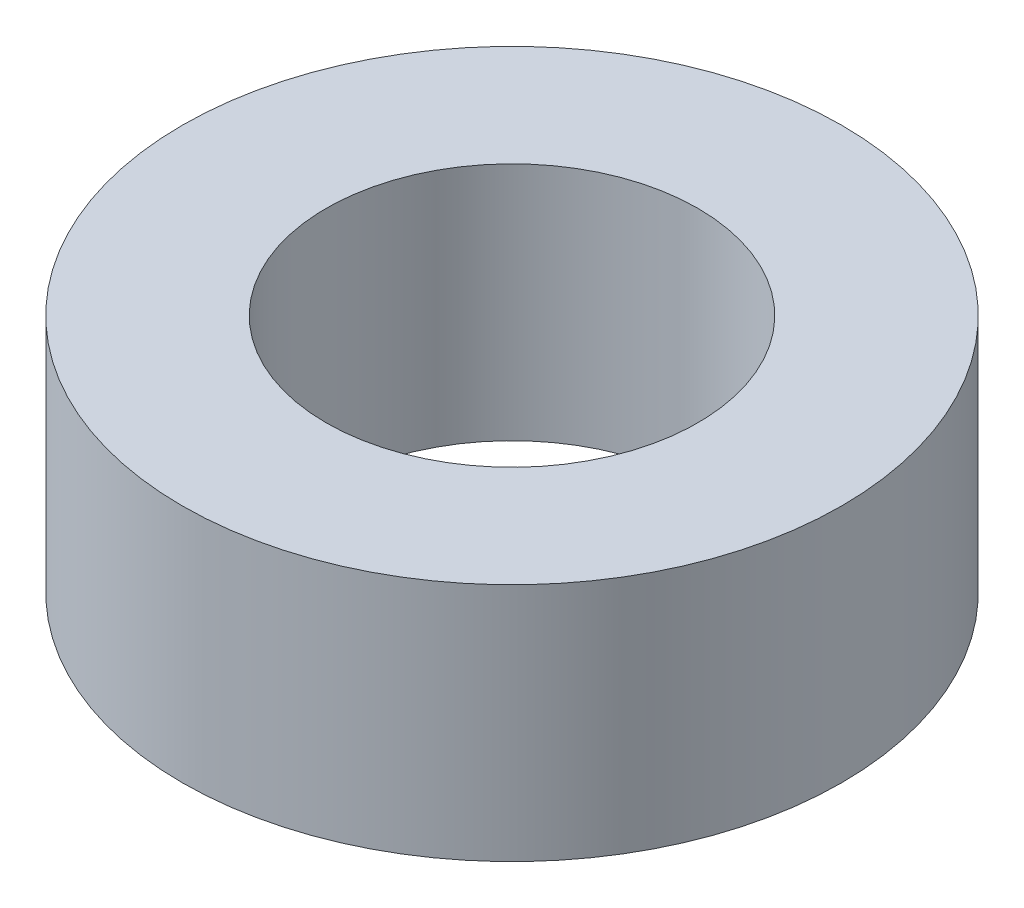
ISO-10303-21;
HEADER;
FILE_DESCRIPTION(('STEP AP214'),'2;1');
FILE_NAME('part.step','',(''),(''),'','','');
FILE_SCHEMA(('AUTOMOTIVE_DESIGN { 1 0 10303 214 1 1 1 1 }'));
ENDSEC;
DATA;
#1=APPLICATION_CONTEXT('core data for automotive mechanical design processes');
#2=APPLICATION_PROTOCOL_DEFINITION('international standard','automotive_design',2000,#1);
#3=PRODUCT_CONTEXT('',#1,'mechanical');
#4=PRODUCT('Part','Part','',(#3));
#5=PRODUCT_RELATED_PRODUCT_CATEGORY('part','',(#4));
#6=PRODUCT_DEFINITION_FORMATION('','',#4);
#7=PRODUCT_DEFINITION_CONTEXT('part definition',#1,'design');
#8=PRODUCT_DEFINITION('design','',#6,#7);
#9=PRODUCT_DEFINITION_SHAPE('','',#8);
#10=(LENGTH_UNIT() NAMED_UNIT(*) SI_UNIT(.MILLI.,.METRE.));
#11=(NAMED_UNIT(*) PLANE_ANGLE_UNIT() SI_UNIT($,.RADIAN.));
#12=(NAMED_UNIT(*) SI_UNIT($,.STERADIAN.) SOLID_ANGLE_UNIT());
#13=UNCERTAINTY_MEASURE_WITH_UNIT(LENGTH_MEASURE(1.E-05),#10,'distance_accuracy_value','');
#14=(GEOMETRIC_REPRESENTATION_CONTEXT(3) GLOBAL_UNCERTAINTY_ASSIGNED_CONTEXT((#13)) GLOBAL_UNIT_ASSIGNED_CONTEXT((#10,
#11,#12)) REPRESENTATION_CONTEXT('',''));
#15=CARTESIAN_POINT('',(0.,0.,0.));
#16=DIRECTION('',(0.,0.,1.));
#17=DIRECTION('',(1.,0.,0.));
#18=AXIS2_PLACEMENT_3D('',#15,#16,#17);
#19=CARTESIAN_POINT('',(0.,2.,0.));
#20=DIRECTION('',(0.,1.,0.));
#21=DIRECTION('',(0.,0.,1.));
#22=AXIS2_PLACEMENT_3D('',#19,#20,#21);
#23=PLANE('',#22);
#24=CARTESIAN_POINT('',(0.,2.,0.));
#25=DIRECTION('',(0.,1.,0.));
#26=DIRECTION('',(0.,0.,1.));
#27=AXIS2_PLACEMENT_3D('',#24,#25,#26);
#28=CIRCLE('',#27,2.75);
#29=CARTESIAN_POINT('',(0.,2.,2.75));
#30=VERTEX_POINT('',#29);
#31=EDGE_CURVE('E10',#30,#30,#28,.T.);
#32=ORIENTED_EDGE('',*,*,#31,.T.);
#33=EDGE_LOOP('',(#32));
#34=FACE_BOUND('',#33,.T.);
#35=CARTESIAN_POINT('',(0.,2.,0.));
#36=DIRECTION('',(0.,1.,0.));
#37=DIRECTION('',(0.,0.,1.));
#38=AXIS2_PLACEMENT_3D('',#35,#36,#37);
#39=CIRCLE('',#38,1.55);
#40=CARTESIAN_POINT('',(0.,2.,1.55));
#41=VERTEX_POINT('',#40);
#42=EDGE_CURVE('E55',#41,#41,#39,.T.);
#43=ORIENTED_EDGE('',*,*,#42,.F.);
#44=EDGE_LOOP('',(#43));
#45=FACE_BOUND('',#44,.T.);
#46=ADVANCED_FACE('F41',(#34,#45),#23,.T.);
#47=CARTESIAN_POINT('',(0.,0.,0.));
#48=DIRECTION('',(0.,1.,0.));
#49=DIRECTION('',(0.,0.,1.));
#50=AXIS2_PLACEMENT_3D('',#47,#48,#49);
#51=PLANE('',#50);
#52=CARTESIAN_POINT('',(0.,0.,0.));
#53=DIRECTION('',(0.,1.,0.));
#54=DIRECTION('',(0.,0.,1.));
#55=AXIS2_PLACEMENT_3D('',#52,#53,#54);
#56=CIRCLE('',#55,2.75);
#57=CARTESIAN_POINT('',(0.,0.,2.75));
#58=VERTEX_POINT('',#57);
#59=EDGE_CURVE('E45',#58,#58,#56,.T.);
#60=ORIENTED_EDGE('',*,*,#59,.F.);
#61=EDGE_LOOP('',(#60));
#62=FACE_BOUND('',#61,.T.);
#63=CARTESIAN_POINT('',(0.,0.,0.));
#64=DIRECTION('',(0.,1.,0.));
#65=DIRECTION('',(0.,0.,1.));
#66=AXIS2_PLACEMENT_3D('',#63,#64,#65);
#67=CIRCLE('',#66,1.55);
#68=CARTESIAN_POINT('',(0.,0.,1.55));
#69=VERTEX_POINT('',#68);
#70=EDGE_CURVE('E57',#69,#69,#67,.T.);
#71=ORIENTED_EDGE('',*,*,#70,.T.);
#72=EDGE_LOOP('',(#71));
#73=FACE_BOUND('',#72,.T.);
#74=ADVANCED_FACE('F70',(#62,#73),#51,.F.);
#75=CARTESIAN_POINT('',(0.,2.,0.));
#76=DIRECTION('',(0.,-1.,0.));
#77=DIRECTION('',(0.,0.,-1.));
#78=AXIS2_PLACEMENT_3D('',#75,#76,#77);
#79=CYLINDRICAL_SURFACE('',#78,2.75);
#80=ORIENTED_EDGE('',*,*,#31,.F.);
#81=EDGE_LOOP('',(#80));
#82=FACE_BOUND('',#81,.T.);
#83=ORIENTED_EDGE('',*,*,#59,.T.);
#84=EDGE_LOOP('',(#83));
#85=FACE_BOUND('',#84,.T.);
#86=ADVANCED_FACE('F43',(#82,#85),#79,.T.);
#87=CARTESIAN_POINT('',(0.,2.,0.));
#88=DIRECTION('',(0.,-1.,0.));
#89=DIRECTION('',(0.,0.,-1.));
#90=AXIS2_PLACEMENT_3D('',#87,#88,#89);
#91=CYLINDRICAL_SURFACE('',#90,1.55);
#92=ORIENTED_EDGE('',*,*,#42,.T.);
#93=EDGE_LOOP('',(#92));
#94=FACE_BOUND('',#93,.T.);
#95=ORIENTED_EDGE('',*,*,#70,.F.);
#96=EDGE_LOOP('',(#95));
#97=FACE_BOUND('',#96,.T.);
#98=ADVANCED_FACE('F66',(#94,#97),#91,.F.);
#99=CLOSED_SHELL('',(#46,#74,#86,#98));
#100=MANIFOLD_SOLID_BREP('B2',#99);
#101=ADVANCED_BREP_SHAPE_REPRESENTATION('',(#18,#100),#14);
#102=SHAPE_DEFINITION_REPRESENTATION(#9,#101);
ENDSEC;
END-ISO-10303-21;
